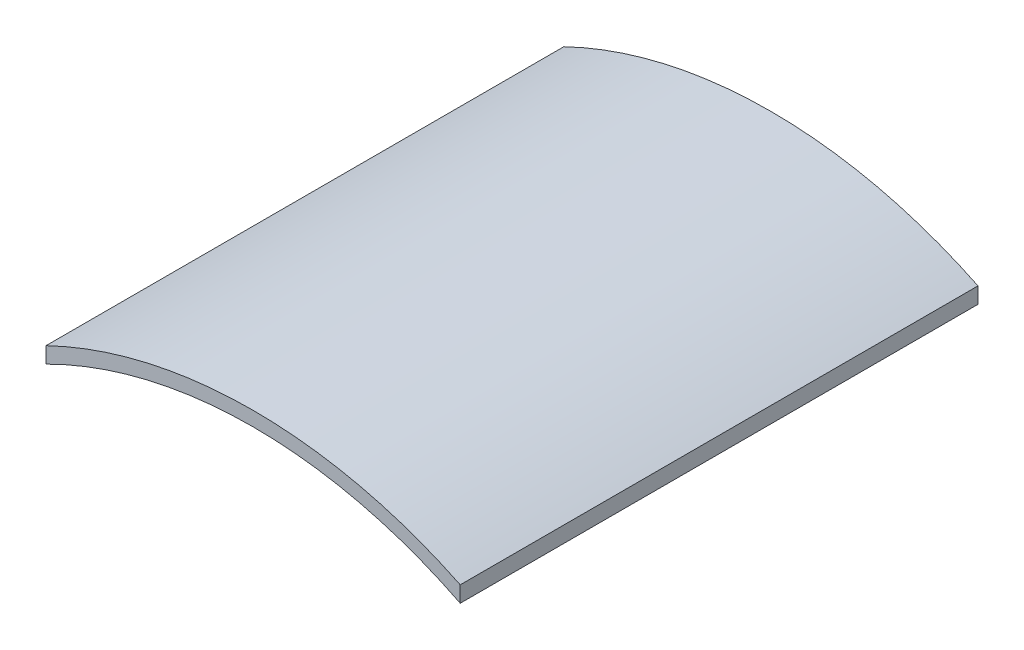
ISO-10303-21;
HEADER;
FILE_DESCRIPTION(('STEP AP214'),'2;1');
FILE_NAME('part.step','',(''),(''),'','','');
FILE_SCHEMA(('AUTOMOTIVE_DESIGN { 1 0 10303 214 1 1 1 1 }'));
ENDSEC;
DATA;
#1=APPLICATION_CONTEXT('core data for automotive mechanical design processes');
#2=APPLICATION_PROTOCOL_DEFINITION('international standard','automotive_design',2000,#1);
#3=PRODUCT_CONTEXT('',#1,'mechanical');
#4=PRODUCT('Part','Part','',(#3));
#5=PRODUCT_RELATED_PRODUCT_CATEGORY('part','',(#4));
#6=PRODUCT_DEFINITION_FORMATION('','',#4);
#7=PRODUCT_DEFINITION_CONTEXT('part definition',#1,'design');
#8=PRODUCT_DEFINITION('design','',#6,#7);
#9=PRODUCT_DEFINITION_SHAPE('','',#8);
#10=(LENGTH_UNIT() NAMED_UNIT(*) SI_UNIT(.MILLI.,.METRE.));
#11=(NAMED_UNIT(*) PLANE_ANGLE_UNIT() SI_UNIT($,.RADIAN.));
#12=(NAMED_UNIT(*) SI_UNIT($,.STERADIAN.) SOLID_ANGLE_UNIT());
#13=UNCERTAINTY_MEASURE_WITH_UNIT(LENGTH_MEASURE(1.E-05),#10,'distance_accuracy_value','');
#14=(GEOMETRIC_REPRESENTATION_CONTEXT(3) GLOBAL_UNCERTAINTY_ASSIGNED_CONTEXT((#13)) GLOBAL_UNIT_ASSIGNED_CONTEXT((#10,
#11,#12)) REPRESENTATION_CONTEXT('',''));
#15=CARTESIAN_POINT('',(0.,0.,0.));
#16=DIRECTION('',(0.,0.,1.));
#17=DIRECTION('',(1.,0.,0.));
#18=AXIS2_PLACEMENT_3D('',#15,#16,#17);
#19=CARTESIAN_POINT('',(0.,0.,60.));
#20=DIRECTION('',(0.,0.,-1.));
#21=DIRECTION('',(-1.,0.,0.));
#22=AXIS2_PLACEMENT_3D('',#19,#20,#21);
#23=CYLINDRICAL_SURFACE('',#22,55.0000000000002);
#24=CARTESIAN_POINT('',(0.,0.,0.));
#25=DIRECTION('',(0.,0.,1.));
#26=DIRECTION('',(-1.,0.,0.));
#27=AXIS2_PLACEMENT_3D('',#24,#25,#26);
#28=CIRCLE('',#27,55.0000000000002);
#29=CARTESIAN_POINT('',(24.,49.4873721266348,0.));
#30=VERTEX_POINT('',#29);
#31=CARTESIAN_POINT('',(-24.,49.4873721266348,0.));
#32=VERTEX_POINT('',#31);
#33=EDGE_CURVE('E113',#30,#32,#28,.T.);
#34=ORIENTED_EDGE('',*,*,#33,.T.);
#35=DIRECTION('',(0.,0.,-1.));
#36=VECTOR('',#35,1.);
#37=CARTESIAN_POINT('',(-24.,49.4873721266348,60.));
#38=LINE('',#37,#36);
#39=CARTESIAN_POINT('',(-24.,49.4873721266348,60.));
#40=VERTEX_POINT('',#39);
#41=EDGE_CURVE('E11',#40,#32,#38,.T.);
#42=ORIENTED_EDGE('',*,*,#41,.F.);
#43=CARTESIAN_POINT('',(0.,0.,60.));
#44=DIRECTION('',(0.,0.,1.));
#45=DIRECTION('',(-1.,0.,0.));
#46=AXIS2_PLACEMENT_3D('',#43,#44,#45);
#47=CIRCLE('',#46,55.0000000000002);
#48=CARTESIAN_POINT('',(24.,49.4873721266348,60.));
#49=VERTEX_POINT('',#48);
#50=EDGE_CURVE('E97',#49,#40,#47,.T.);
#51=ORIENTED_EDGE('',*,*,#50,.F.);
#52=DIRECTION('',(0.,0.,-1.));
#53=VECTOR('',#52,1.);
#54=CARTESIAN_POINT('',(24.,49.4873721266348,60.));
#55=LINE('',#54,#53);
#56=EDGE_CURVE('E109',#49,#30,#55,.T.);
#57=ORIENTED_EDGE('',*,*,#56,.T.);
#58=EDGE_LOOP('',(#34,#42,#51,#57));
#59=FACE_BOUND('',#58,.T.);
#60=ADVANCED_FACE('F45',(#59),#23,.T.);
#61=CARTESIAN_POINT('',(-24.,49.4873721266348,60.));
#62=DIRECTION('',(1.,0.,0.));
#63=DIRECTION('',(0.,0.,-1.));
#64=AXIS2_PLACEMENT_3D('',#61,#62,#63);
#65=PLANE('',#64);
#66=DIRECTION('',(0.,-1.,0.));
#67=VECTOR('',#66,1.);
#68=CARTESIAN_POINT('',(-24.,49.4873721266348,0.));
#69=LINE('',#68,#67);
#70=CARTESIAN_POINT('',(-24.,47.6337750946711,0.));
#71=VERTEX_POINT('',#70);
#72=EDGE_CURVE('E102',#32,#71,#69,.T.);
#73=ORIENTED_EDGE('',*,*,#72,.T.);
#74=DIRECTION('',(0.,0.,-1.));
#75=VECTOR('',#74,1.);
#76=CARTESIAN_POINT('',(-24.,47.6337750946711,60.));
#77=LINE('',#76,#75);
#78=CARTESIAN_POINT('',(-24.,47.6337750946711,60.));
#79=VERTEX_POINT('',#78);
#80=EDGE_CURVE('E54',#79,#71,#77,.T.);
#81=ORIENTED_EDGE('',*,*,#80,.F.);
#82=DIRECTION('',(0.,-1.,0.));
#83=VECTOR('',#82,1.);
#84=CARTESIAN_POINT('',(-24.,49.4873721266348,60.));
#85=LINE('',#84,#83);
#86=EDGE_CURVE('E92',#40,#79,#85,.T.);
#87=ORIENTED_EDGE('',*,*,#86,.F.);
#88=ORIENTED_EDGE('',*,*,#41,.T.);
#89=EDGE_LOOP('',(#73,#81,#87,#88));
#90=FACE_BOUND('',#89,.T.);
#91=ADVANCED_FACE('F101',(#90),#65,.F.);
#92=CARTESIAN_POINT('',(0.,0.,60.));
#93=DIRECTION('',(0.,0.,-1.));
#94=DIRECTION('',(-1.,0.,0.));
#95=AXIS2_PLACEMENT_3D('',#92,#93,#94);
#96=CYLINDRICAL_SURFACE('',#95,53.3383214000001);
#97=CARTESIAN_POINT('',(0.,0.,0.));
#98=DIRECTION('',(0.,0.,-1.));
#99=DIRECTION('',(-1.,0.,0.));
#100=AXIS2_PLACEMENT_3D('',#97,#98,#99);
#101=CIRCLE('',#100,53.3383214000001);
#102=CARTESIAN_POINT('',(24.,47.6337750946711,0.));
#103=VERTEX_POINT('',#102);
#104=EDGE_CURVE('E79',#71,#103,#101,.T.);
#105=ORIENTED_EDGE('',*,*,#104,.T.);
#106=DIRECTION('',(0.,0.,-1.));
#107=VECTOR('',#106,1.);
#108=CARTESIAN_POINT('',(24.,47.6337750946711,60.));
#109=LINE('',#108,#107);
#110=CARTESIAN_POINT('',(24.,47.6337750946711,60.));
#111=VERTEX_POINT('',#110);
#112=EDGE_CURVE('E104',#111,#103,#109,.T.);
#113=ORIENTED_EDGE('',*,*,#112,.F.);
#114=CARTESIAN_POINT('',(0.,0.,60.));
#115=DIRECTION('',(0.,0.,-1.));
#116=DIRECTION('',(-1.,0.,0.));
#117=AXIS2_PLACEMENT_3D('',#114,#115,#116);
#118=CIRCLE('',#117,53.3383214000001);
#119=EDGE_CURVE('E95',#79,#111,#118,.T.);
#120=ORIENTED_EDGE('',*,*,#119,.F.);
#121=ORIENTED_EDGE('',*,*,#80,.T.);
#122=EDGE_LOOP('',(#105,#113,#120,#121));
#123=FACE_BOUND('',#122,.T.);
#124=ADVANCED_FACE('F105',(#123),#96,.F.);
#125=CARTESIAN_POINT('',(24.,49.4873721266348,60.));
#126=DIRECTION('',(-1.,0.,0.));
#127=DIRECTION('',(0.,0.,1.));
#128=AXIS2_PLACEMENT_3D('',#125,#126,#127);
#129=PLANE('',#128);
#130=DIRECTION('',(0.,1.,0.));
#131=VECTOR('',#130,1.);
#132=CARTESIAN_POINT('',(24.,49.4873721266348,0.));
#133=LINE('',#132,#131);
#134=EDGE_CURVE('E85',#103,#30,#133,.T.);
#135=ORIENTED_EDGE('',*,*,#134,.T.);
#136=ORIENTED_EDGE('',*,*,#56,.F.);
#137=DIRECTION('',(0.,1.,0.));
#138=VECTOR('',#137,1.);
#139=CARTESIAN_POINT('',(24.,49.4873721266348,60.));
#140=LINE('',#139,#138);
#141=EDGE_CURVE('E62',#111,#49,#140,.T.);
#142=ORIENTED_EDGE('',*,*,#141,.F.);
#143=ORIENTED_EDGE('',*,*,#112,.T.);
#144=EDGE_LOOP('',(#135,#136,#142,#143));
#145=FACE_BOUND('',#144,.T.);
#146=ADVANCED_FACE('F126',(#145),#129,.F.);
#147=CARTESIAN_POINT('',(0.,0.,60.));
#148=DIRECTION('',(0.,0.,-1.));
#149=DIRECTION('',(-1.,0.,0.));
#150=AXIS2_PLACEMENT_3D('',#147,#148,#149);
#151=PLANE('',#150);
#152=ORIENTED_EDGE('',*,*,#50,.T.);
#153=ORIENTED_EDGE('',*,*,#86,.T.);
#154=ORIENTED_EDGE('',*,*,#119,.T.);
#155=ORIENTED_EDGE('',*,*,#141,.T.);
#156=EDGE_LOOP('',(#152,#153,#154,#155));
#157=FACE_BOUND('',#156,.T.);
#158=ADVANCED_FACE('F93',(#157),#151,.F.);
#159=CARTESIAN_POINT('',(0.,0.,0.));
#160=DIRECTION('',(0.,0.,-1.));
#161=DIRECTION('',(-1.,0.,0.));
#162=AXIS2_PLACEMENT_3D('',#159,#160,#161);
#163=PLANE('',#162);
#164=ORIENTED_EDGE('',*,*,#33,.F.);
#165=ORIENTED_EDGE('',*,*,#134,.F.);
#166=ORIENTED_EDGE('',*,*,#104,.F.);
#167=ORIENTED_EDGE('',*,*,#72,.F.);
#168=EDGE_LOOP('',(#164,#165,#166,#167));
#169=FACE_BOUND('',#168,.T.);
#170=ADVANCED_FACE('F129',(#169),#163,.T.);
#171=CLOSED_SHELL('',(#60,#91,#124,#146,#158,#170));
#172=MANIFOLD_SOLID_BREP('B2',#171);
#173=ADVANCED_BREP_SHAPE_REPRESENTATION('',(#18,#172),#14);
#174=SHAPE_DEFINITION_REPRESENTATION(#9,#173);
ENDSEC;
END-ISO-10303-21;
